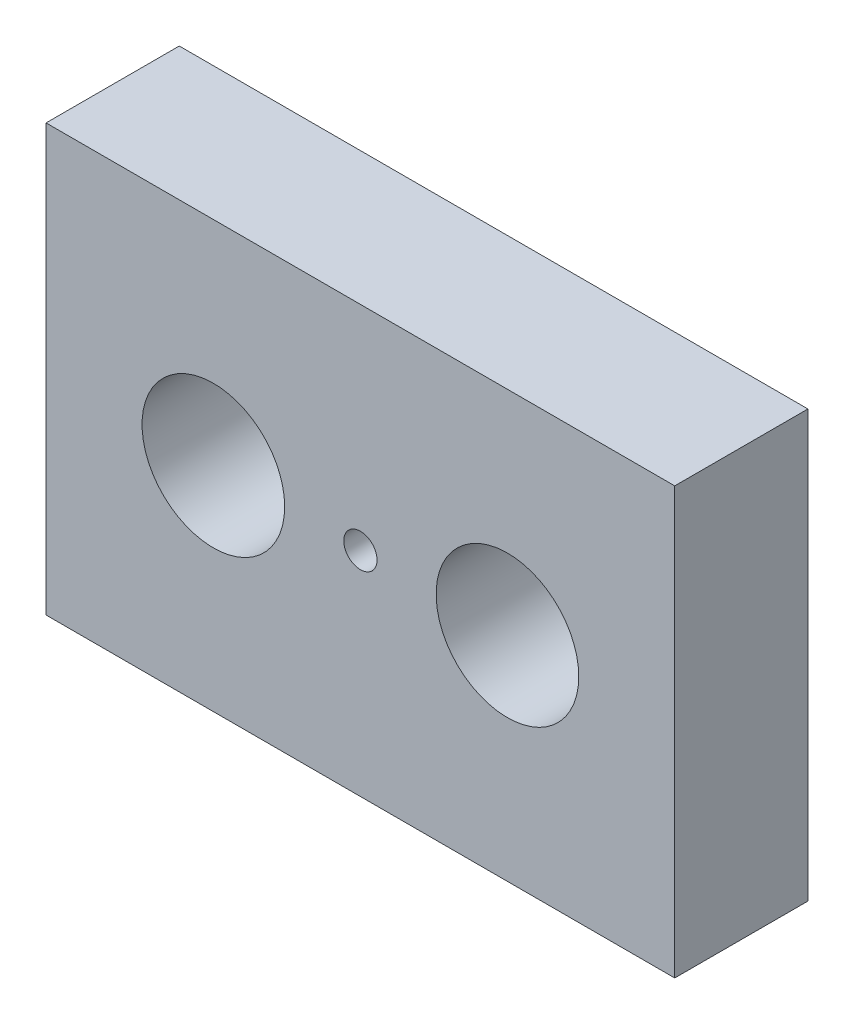
ISO-10303-21;
HEADER;
FILE_DESCRIPTION(('STEP AP214'),'2;1');
FILE_NAME('part.step','',(''),(''),'','','');
FILE_SCHEMA(('AUTOMOTIVE_DESIGN { 1 0 10303 214 1 1 1 1 }'));
ENDSEC;
DATA;
#1=APPLICATION_CONTEXT('core data for automotive mechanical design processes');
#2=APPLICATION_PROTOCOL_DEFINITION('international standard','automotive_design',2000,#1);
#3=PRODUCT_CONTEXT('',#1,'mechanical');
#4=PRODUCT('Part','Part','',(#3));
#5=PRODUCT_RELATED_PRODUCT_CATEGORY('part','',(#4));
#6=PRODUCT_DEFINITION_FORMATION('','',#4);
#7=PRODUCT_DEFINITION_CONTEXT('part definition',#1,'design');
#8=PRODUCT_DEFINITION('design','',#6,#7);
#9=PRODUCT_DEFINITION_SHAPE('','',#8);
#10=(LENGTH_UNIT() NAMED_UNIT(*) SI_UNIT(.MILLI.,.METRE.));
#11=(NAMED_UNIT(*) PLANE_ANGLE_UNIT() SI_UNIT($,.RADIAN.));
#12=(NAMED_UNIT(*) SI_UNIT($,.STERADIAN.) SOLID_ANGLE_UNIT());
#13=UNCERTAINTY_MEASURE_WITH_UNIT(LENGTH_MEASURE(1.E-05),#10,'distance_accuracy_value','');
#14=(GEOMETRIC_REPRESENTATION_CONTEXT(3) GLOBAL_UNCERTAINTY_ASSIGNED_CONTEXT((#13)) GLOBAL_UNIT_ASSIGNED_CONTEXT((#10,
#11,#12)) REPRESENTATION_CONTEXT('',''));
#15=CARTESIAN_POINT('',(0.,0.,0.));
#16=DIRECTION('',(0.,0.,1.));
#17=DIRECTION('',(1.,0.,0.));
#18=AXIS2_PLACEMENT_3D('',#15,#16,#17);
#19=CARTESIAN_POINT('',(0.,0.,3.175));
#20=DIRECTION('',(1.,0.,0.));
#21=DIRECTION('',(0.,1.,0.));
#22=AXIS2_PLACEMENT_3D('',#19,#20,#21);
#23=PLANE('',#22);
#24=DIRECTION('',(0.,-1.,0.));
#25=VECTOR('',#24,1.);
#26=CARTESIAN_POINT('',(0.,0.,0.));
#27=LINE('',#26,#25);
#28=CARTESIAN_POINT('',(0.,10.16,0.));
#29=VERTEX_POINT('',#28);
#30=CARTESIAN_POINT('',(0.,0.,0.));
#31=VERTEX_POINT('',#30);
#32=EDGE_CURVE('E98',#29,#31,#27,.T.);
#33=ORIENTED_EDGE('',*,*,#32,.T.);
#34=DIRECTION('',(0.,0.,-1.));
#35=VECTOR('',#34,1.);
#36=CARTESIAN_POINT('',(0.,0.,3.175));
#37=LINE('',#36,#35);
#38=CARTESIAN_POINT('',(0.,0.,3.175));
#39=VERTEX_POINT('',#38);
#40=EDGE_CURVE('E11',#39,#31,#37,.T.);
#41=ORIENTED_EDGE('',*,*,#40,.F.);
#42=DIRECTION('',(0.,-1.,0.));
#43=VECTOR('',#42,1.);
#44=CARTESIAN_POINT('',(0.,0.,3.175));
#45=LINE('',#44,#43);
#46=CARTESIAN_POINT('',(0.,10.16,3.175));
#47=VERTEX_POINT('',#46);
#48=EDGE_CURVE('E85',#47,#39,#45,.T.);
#49=ORIENTED_EDGE('',*,*,#48,.F.);
#50=DIRECTION('',(0.,0.,-1.));
#51=VECTOR('',#50,1.);
#52=CARTESIAN_POINT('',(0.,10.16,3.175));
#53=LINE('',#52,#51);
#54=EDGE_CURVE('E94',#47,#29,#53,.T.);
#55=ORIENTED_EDGE('',*,*,#54,.T.);
#56=EDGE_LOOP('',(#33,#41,#49,#55));
#57=FACE_BOUND('',#56,.T.);
#58=ADVANCED_FACE('F33',(#57),#23,.F.);
#59=CARTESIAN_POINT('',(0.,0.,3.175));
#60=DIRECTION('',(0.,1.,0.));
#61=DIRECTION('',(0.,0.,1.));
#62=AXIS2_PLACEMENT_3D('',#59,#60,#61);
#63=PLANE('',#62);
#64=DIRECTION('',(1.,0.,0.));
#65=VECTOR('',#64,1.);
#66=CARTESIAN_POINT('',(0.,0.,0.));
#67=LINE('',#66,#65);
#68=CARTESIAN_POINT('',(14.986,0.,0.));
#69=VERTEX_POINT('',#68);
#70=EDGE_CURVE('E89',#31,#69,#67,.T.);
#71=ORIENTED_EDGE('',*,*,#70,.T.);
#72=DIRECTION('',(0.,0.,-1.));
#73=VECTOR('',#72,1.);
#74=CARTESIAN_POINT('',(14.986,0.,3.175));
#75=LINE('',#74,#73);
#76=CARTESIAN_POINT('',(14.986,0.,3.175));
#77=VERTEX_POINT('',#76);
#78=EDGE_CURVE('E42',#77,#69,#75,.T.);
#79=ORIENTED_EDGE('',*,*,#78,.F.);
#80=DIRECTION('',(1.,0.,0.));
#81=VECTOR('',#80,1.);
#82=CARTESIAN_POINT('',(0.,0.,3.175));
#83=LINE('',#82,#81);
#84=EDGE_CURVE('E80',#39,#77,#83,.T.);
#85=ORIENTED_EDGE('',*,*,#84,.F.);
#86=ORIENTED_EDGE('',*,*,#40,.T.);
#87=EDGE_LOOP('',(#71,#79,#85,#86));
#88=FACE_BOUND('',#87,.T.);
#89=ADVANCED_FACE('F88',(#88),#63,.F.);
#90=CARTESIAN_POINT('',(14.986,0.,3.175));
#91=DIRECTION('',(-1.,0.,0.));
#92=DIRECTION('',(0.,-1.,0.));
#93=AXIS2_PLACEMENT_3D('',#90,#91,#92);
#94=PLANE('',#93);
#95=DIRECTION('',(0.,1.,0.));
#96=VECTOR('',#95,1.);
#97=CARTESIAN_POINT('',(14.986,0.,0.));
#98=LINE('',#97,#96);
#99=CARTESIAN_POINT('',(14.986,10.16,0.));
#100=VERTEX_POINT('',#99);
#101=EDGE_CURVE('E67',#69,#100,#98,.T.);
#102=ORIENTED_EDGE('',*,*,#101,.T.);
#103=DIRECTION('',(0.,0.,-1.));
#104=VECTOR('',#103,1.);
#105=CARTESIAN_POINT('',(14.986,10.16,3.175));
#106=LINE('',#105,#104);
#107=CARTESIAN_POINT('',(14.986,10.16,3.175));
#108=VERTEX_POINT('',#107);
#109=EDGE_CURVE('E90',#108,#100,#106,.T.);
#110=ORIENTED_EDGE('',*,*,#109,.F.);
#111=DIRECTION('',(0.,1.,0.));
#112=VECTOR('',#111,1.);
#113=CARTESIAN_POINT('',(14.986,0.,3.175));
#114=LINE('',#113,#112);
#115=EDGE_CURVE('E83',#77,#108,#114,.T.);
#116=ORIENTED_EDGE('',*,*,#115,.F.);
#117=ORIENTED_EDGE('',*,*,#78,.T.);
#118=EDGE_LOOP('',(#102,#110,#116,#117));
#119=FACE_BOUND('',#118,.T.);
#120=ADVANCED_FACE('F92',(#119),#94,.F.);
#121=CARTESIAN_POINT('',(0.,10.16,3.175));
#122=DIRECTION('',(0.,-1.,0.));
#123=DIRECTION('',(0.,0.,-1.));
#124=AXIS2_PLACEMENT_3D('',#121,#122,#123);
#125=PLANE('',#124);
#126=DIRECTION('',(-1.,0.,0.));
#127=VECTOR('',#126,1.);
#128=CARTESIAN_POINT('',(0.,10.16,0.));
#129=LINE('',#128,#127);
#130=EDGE_CURVE('E73',#100,#29,#129,.T.);
#131=ORIENTED_EDGE('',*,*,#130,.T.);
#132=ORIENTED_EDGE('',*,*,#54,.F.);
#133=DIRECTION('',(-1.,0.,0.));
#134=VECTOR('',#133,1.);
#135=CARTESIAN_POINT('',(0.,10.16,3.175));
#136=LINE('',#135,#134);
#137=EDGE_CURVE('E50',#108,#47,#136,.T.);
#138=ORIENTED_EDGE('',*,*,#137,.F.);
#139=ORIENTED_EDGE('',*,*,#109,.T.);
#140=EDGE_LOOP('',(#131,#132,#138,#139));
#141=FACE_BOUND('',#140,.T.);
#142=ADVANCED_FACE('F106',(#141),#125,.F.);
#143=CARTESIAN_POINT('',(0.,10.16,3.175));
#144=DIRECTION('',(0.,0.,-1.));
#145=DIRECTION('',(-1.,0.,0.));
#146=AXIS2_PLACEMENT_3D('',#143,#144,#145);
#147=PLANE('',#146);
#148=CARTESIAN_POINT('',(7.493,5.08,3.175));
#149=DIRECTION('',(0.,0.,1.));
#150=DIRECTION('',(1.,0.,0.));
#151=AXIS2_PLACEMENT_3D('',#148,#149,#150);
#152=CIRCLE('',#151,0.396875);
#153=CARTESIAN_POINT('',(7.889875,5.08,3.175));
#154=VERTEX_POINT('',#153);
#155=EDGE_CURVE('E121',#154,#154,#152,.T.);
#156=ORIENTED_EDGE('',*,*,#155,.F.);
#157=EDGE_LOOP('',(#156));
#158=FACE_BOUND('',#157,.T.);
#159=CARTESIAN_POINT('',(10.9982,5.08,3.175));
#160=DIRECTION('',(0.,0.,1.));
#161=DIRECTION('',(1.,0.,0.));
#162=AXIS2_PLACEMENT_3D('',#159,#160,#161);
#163=CIRCLE('',#162,1.69999999999999);
#164=CARTESIAN_POINT('',(12.6982,5.08,3.175));
#165=VERTEX_POINT('',#164);
#166=EDGE_CURVE('E117',#165,#165,#163,.T.);
#167=ORIENTED_EDGE('',*,*,#166,.F.);
#168=EDGE_LOOP('',(#167));
#169=FACE_BOUND('',#168,.T.);
#170=CARTESIAN_POINT('',(3.9878,5.08,3.175));
#171=DIRECTION('',(0.,0.,1.));
#172=DIRECTION('',(1.,0.,0.));
#173=AXIS2_PLACEMENT_3D('',#170,#171,#172);
#174=CIRCLE('',#173,1.69999999999999);
#175=CARTESIAN_POINT('',(5.68779999999999,5.08,3.175));
#176=VERTEX_POINT('',#175);
#177=EDGE_CURVE('E114',#176,#176,#174,.T.);
#178=ORIENTED_EDGE('',*,*,#177,.F.);
#179=EDGE_LOOP('',(#178));
#180=FACE_BOUND('',#179,.T.);
#181=ORIENTED_EDGE('',*,*,#48,.T.);
#182=ORIENTED_EDGE('',*,*,#84,.T.);
#183=ORIENTED_EDGE('',*,*,#115,.T.);
#184=ORIENTED_EDGE('',*,*,#137,.T.);
#185=EDGE_LOOP('',(#181,#182,#183,#184));
#186=FACE_BOUND('',#185,.T.);
#187=ADVANCED_FACE('F81',(#158,#169,#180,#186),#147,.F.);
#188=CARTESIAN_POINT('',(0.,10.16,0.));
#189=DIRECTION('',(0.,0.,-1.));
#190=DIRECTION('',(-1.,0.,0.));
#191=AXIS2_PLACEMENT_3D('',#188,#189,#190);
#192=PLANE('',#191);
#193=CARTESIAN_POINT('',(7.493,5.08,0.));
#194=DIRECTION('',(0.,0.,1.));
#195=DIRECTION('',(1.,0.,0.));
#196=AXIS2_PLACEMENT_3D('',#193,#194,#195);
#197=CIRCLE('',#196,0.396875);
#198=CARTESIAN_POINT('',(7.889875,5.08,0.));
#199=VERTEX_POINT('',#198);
#200=EDGE_CURVE('E120',#199,#199,#197,.T.);
#201=ORIENTED_EDGE('',*,*,#200,.T.);
#202=EDGE_LOOP('',(#201));
#203=FACE_BOUND('',#202,.T.);
#204=CARTESIAN_POINT('',(10.9982,5.08,0.));
#205=DIRECTION('',(0.,0.,-1.));
#206=DIRECTION('',(-1.,0.,0.));
#207=AXIS2_PLACEMENT_3D('',#204,#205,#206);
#208=CIRCLE('',#207,1.69999999999999);
#209=CARTESIAN_POINT('',(9.29820000000001,5.08,0.));
#210=VERTEX_POINT('',#209);
#211=EDGE_CURVE('E36',#210,#210,#208,.T.);
#212=ORIENTED_EDGE('',*,*,#211,.F.);
#213=EDGE_LOOP('',(#212));
#214=FACE_BOUND('',#213,.T.);
#215=CARTESIAN_POINT('',(3.9878,5.08,0.));
#216=DIRECTION('',(0.,0.,-1.));
#217=DIRECTION('',(-1.,0.,0.));
#218=AXIS2_PLACEMENT_3D('',#215,#216,#217);
#219=CIRCLE('',#218,1.69999999999999);
#220=CARTESIAN_POINT('',(2.28780000000001,5.08,0.));
#221=VERTEX_POINT('',#220);
#222=EDGE_CURVE('E101',#221,#221,#219,.T.);
#223=ORIENTED_EDGE('',*,*,#222,.F.);
#224=EDGE_LOOP('',(#223));
#225=FACE_BOUND('',#224,.T.);
#226=ORIENTED_EDGE('',*,*,#32,.F.);
#227=ORIENTED_EDGE('',*,*,#130,.F.);
#228=ORIENTED_EDGE('',*,*,#101,.F.);
#229=ORIENTED_EDGE('',*,*,#70,.F.);
#230=EDGE_LOOP('',(#226,#227,#228,#229));
#231=FACE_BOUND('',#230,.T.);
#232=ADVANCED_FACE('F109',(#203,#214,#225,#231),#192,.T.);
#233=CARTESIAN_POINT('',(3.9878,5.08,3.175));
#234=DIRECTION('',(0.,0.,1.));
#235=DIRECTION('',(1.,0.,0.));
#236=AXIS2_PLACEMENT_3D('',#233,#234,#235);
#237=CYLINDRICAL_SURFACE('',#236,1.69999999999999);
#238=ORIENTED_EDGE('',*,*,#222,.T.);
#239=EDGE_LOOP('',(#238));
#240=FACE_BOUND('',#239,.T.);
#241=ORIENTED_EDGE('',*,*,#177,.T.);
#242=EDGE_LOOP('',(#241));
#243=FACE_BOUND('',#242,.T.);
#244=ADVANCED_FACE('F143',(#240,#243),#237,.F.);
#245=CARTESIAN_POINT('',(10.9982,5.08,3.175));
#246=DIRECTION('',(0.,0.,1.));
#247=DIRECTION('',(1.,0.,0.));
#248=AXIS2_PLACEMENT_3D('',#245,#246,#247);
#249=CYLINDRICAL_SURFACE('',#248,1.69999999999999);
#250=ORIENTED_EDGE('',*,*,#211,.T.);
#251=EDGE_LOOP('',(#250));
#252=FACE_BOUND('',#251,.T.);
#253=ORIENTED_EDGE('',*,*,#166,.T.);
#254=EDGE_LOOP('',(#253));
#255=FACE_BOUND('',#254,.T.);
#256=ADVANCED_FACE('F132',(#252,#255),#249,.F.);
#257=CARTESIAN_POINT('',(7.493,5.08,0.));
#258=DIRECTION('',(0.,0.,1.));
#259=DIRECTION('',(1.,0.,0.));
#260=AXIS2_PLACEMENT_3D('',#257,#258,#259);
#261=CYLINDRICAL_SURFACE('',#260,0.396875);
#262=ORIENTED_EDGE('',*,*,#200,.F.);
#263=EDGE_LOOP('',(#262));
#264=FACE_BOUND('',#263,.T.);
#265=ORIENTED_EDGE('',*,*,#155,.T.);
#266=EDGE_LOOP('',(#265));
#267=FACE_BOUND('',#266,.T.);
#268=ADVANCED_FACE('F129',(#264,#267),#261,.F.);
#269=CLOSED_SHELL('',(#58,#89,#120,#142,#187,#232,#244,#256,#268));
#270=MANIFOLD_SOLID_BREP('B2',#269);
#271=ADVANCED_BREP_SHAPE_REPRESENTATION('',(#18,#270),#14);
#272=SHAPE_DEFINITION_REPRESENTATION(#9,#271);
ENDSEC;
END-ISO-10303-21;
